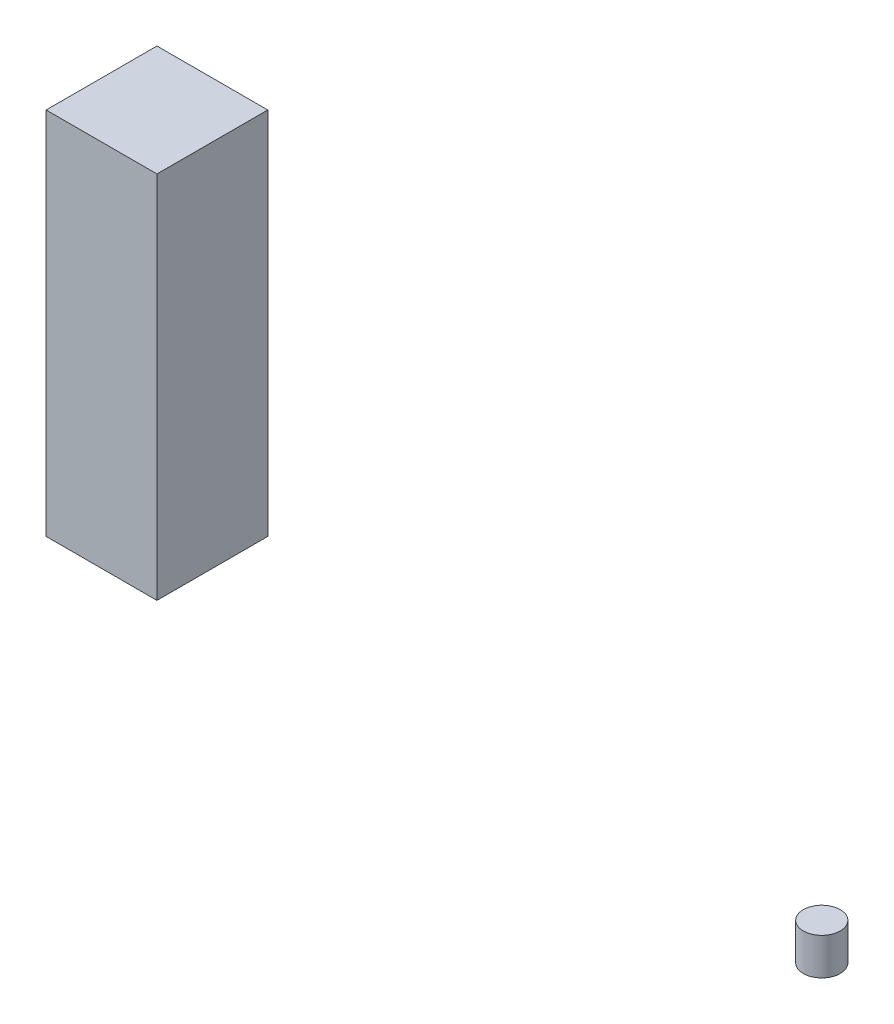
ISO-10303-21;
HEADER;
FILE_DESCRIPTION(('STEP AP214'),'2;1');
FILE_NAME('part.step','',(''),(''),'','','');
FILE_SCHEMA(('AUTOMOTIVE_DESIGN { 1 0 10303 214 1 1 1 1 }'));
ENDSEC;
DATA;
#1=APPLICATION_CONTEXT('core data for automotive mechanical design processes');
#2=APPLICATION_PROTOCOL_DEFINITION('international standard','automotive_design',2000,#1);
#3=PRODUCT_CONTEXT('',#1,'mechanical');
#4=PRODUCT('Part','Part','',(#3));
#5=PRODUCT_RELATED_PRODUCT_CATEGORY('part','',(#4));
#6=PRODUCT_DEFINITION_FORMATION('','',#4);
#7=PRODUCT_DEFINITION_CONTEXT('part definition',#1,'design');
#8=PRODUCT_DEFINITION('design','',#6,#7);
#9=PRODUCT_DEFINITION_SHAPE('','',#8);
#10=(LENGTH_UNIT() NAMED_UNIT(*) SI_UNIT(.MILLI.,.METRE.));
#11=(NAMED_UNIT(*) PLANE_ANGLE_UNIT() SI_UNIT($,.RADIAN.));
#12=(NAMED_UNIT(*) SI_UNIT($,.STERADIAN.) SOLID_ANGLE_UNIT());
#13=UNCERTAINTY_MEASURE_WITH_UNIT(LENGTH_MEASURE(1.E-05),#10,'distance_accuracy_value','');
#14=(GEOMETRIC_REPRESENTATION_CONTEXT(3) GLOBAL_UNCERTAINTY_ASSIGNED_CONTEXT((#13)) GLOBAL_UNIT_ASSIGNED_CONTEXT((#10,
#11,#12)) REPRESENTATION_CONTEXT('',''));
#15=CARTESIAN_POINT('',(0.,0.,0.));
#16=DIRECTION('',(0.,0.,1.));
#17=DIRECTION('',(1.,0.,0.));
#18=AXIS2_PLACEMENT_3D('',#15,#16,#17);
#19=CARTESIAN_POINT('',(180.,-10.,0.));
#20=DIRECTION('',(0.,1.,0.));
#21=DIRECTION('',(0.,0.,1.));
#22=AXIS2_PLACEMENT_3D('',#19,#20,#21);
#23=CYLINDRICAL_SURFACE('',#22,5.00000000000002);
#24=CARTESIAN_POINT('',(180.,-10.,0.));
#25=DIRECTION('',(0.,-1.,0.));
#26=DIRECTION('',(0.,0.,-1.));
#27=AXIS2_PLACEMENT_3D('',#24,#25,#26);
#28=CIRCLE('',#27,5.00000000000002);
#29=CARTESIAN_POINT('',(180.,-10.,-5.00000000000002));
#30=VERTEX_POINT('',#29);
#31=EDGE_CURVE('E11',#30,#30,#28,.T.);
#32=ORIENTED_EDGE('',*,*,#31,.F.);
#33=EDGE_LOOP('',(#32));
#34=FACE_BOUND('',#33,.T.);
#35=CARTESIAN_POINT('',(180.,0.,0.));
#36=DIRECTION('',(0.,-1.,0.));
#37=DIRECTION('',(0.,0.,-1.));
#38=AXIS2_PLACEMENT_3D('',#35,#36,#37);
#39=CIRCLE('',#38,5.00000000000002);
#40=CARTESIAN_POINT('',(180.,0.,-5.00000000000002));
#41=VERTEX_POINT('',#40);
#42=EDGE_CURVE('E44',#41,#41,#39,.T.);
#43=ORIENTED_EDGE('',*,*,#42,.T.);
#44=EDGE_LOOP('',(#43));
#45=FACE_BOUND('',#44,.T.);
#46=ADVANCED_FACE('F41',(#34,#45),#23,.T.);
#47=CARTESIAN_POINT('',(180.,-10.,0.));
#48=DIRECTION('',(0.,-1.,0.));
#49=DIRECTION('',(0.,0.,-1.));
#50=AXIS2_PLACEMENT_3D('',#47,#48,#49);
#51=PLANE('',#50);
#52=ORIENTED_EDGE('',*,*,#31,.T.);
#53=EDGE_LOOP('',(#52));
#54=FACE_BOUND('',#53,.T.);
#55=ADVANCED_FACE('F56',(#54),#51,.T.);
#56=CARTESIAN_POINT('',(180.,0.,0.));
#57=DIRECTION('',(0.,-1.,0.));
#58=DIRECTION('',(0.,0.,-1.));
#59=AXIS2_PLACEMENT_3D('',#56,#57,#58);
#60=PLANE('',#59);
#61=ORIENTED_EDGE('',*,*,#42,.F.);
#62=EDGE_LOOP('',(#61));
#63=FACE_BOUND('',#62,.T.);
#64=ADVANCED_FACE('F54',(#63),#60,.F.);
#65=CLOSED_SHELL('',(#46,#55,#64));
#66=MANIFOLD_SOLID_BREP('B2',#65);
#67=CARTESIAN_POINT('',(-15.,100.,15.));
#68=DIRECTION('',(1.,0.,0.));
#69=DIRECTION('',(0.,0.,-1.));
#70=AXIS2_PLACEMENT_3D('',#67,#68,#69);
#71=PLANE('',#70);
#72=DIRECTION('',(0.,0.,1.));
#73=VECTOR('',#72,1.);
#74=CARTESIAN_POINT('',(-15.,0.,15.));
#75=LINE('',#74,#73);
#76=CARTESIAN_POINT('',(-15.,0.,-15.));
#77=VERTEX_POINT('',#76);
#78=CARTESIAN_POINT('',(-15.,0.,15.));
#79=VERTEX_POINT('',#78);
#80=EDGE_CURVE('E145',#77,#79,#75,.T.);
#81=ORIENTED_EDGE('',*,*,#80,.T.);
#82=DIRECTION('',(0.,-1.,0.));
#83=VECTOR('',#82,1.);
#84=CARTESIAN_POINT('',(-15.,100.,15.));
#85=LINE('',#84,#83);
#86=CARTESIAN_POINT('',(-15.,100.,15.));
#87=VERTEX_POINT('',#86);
#88=EDGE_CURVE('E39',#87,#79,#85,.T.);
#89=ORIENTED_EDGE('',*,*,#88,.F.);
#90=DIRECTION('',(0.,0.,1.));
#91=VECTOR('',#90,1.);
#92=CARTESIAN_POINT('',(-15.,100.,15.));
#93=LINE('',#92,#91);
#94=CARTESIAN_POINT('',(-15.,100.,-15.));
#95=VERTEX_POINT('',#94);
#96=EDGE_CURVE('E133',#95,#87,#93,.T.);
#97=ORIENTED_EDGE('',*,*,#96,.F.);
#98=DIRECTION('',(0.,-1.,0.));
#99=VECTOR('',#98,1.);
#100=CARTESIAN_POINT('',(-15.,100.,-15.));
#101=LINE('',#100,#99);
#102=EDGE_CURVE('E141',#95,#77,#101,.T.);
#103=ORIENTED_EDGE('',*,*,#102,.T.);
#104=EDGE_LOOP('',(#81,#89,#97,#103));
#105=FACE_BOUND('',#104,.T.);
#106=ADVANCED_FACE('F82',(#105),#71,.F.);
#107=CARTESIAN_POINT('',(15.,100.,15.));
#108=DIRECTION('',(0.,0.,-1.));
#109=DIRECTION('',(-1.,0.,0.));
#110=AXIS2_PLACEMENT_3D('',#107,#108,#109);
#111=PLANE('',#110);
#112=DIRECTION('',(1.,0.,0.));
#113=VECTOR('',#112,1.);
#114=CARTESIAN_POINT('',(15.,0.,15.));
#115=LINE('',#114,#113);
#116=CARTESIAN_POINT('',(15.,0.,15.));
#117=VERTEX_POINT('',#116);
#118=EDGE_CURVE('E137',#79,#117,#115,.T.);
#119=ORIENTED_EDGE('',*,*,#118,.T.);
#120=DIRECTION('',(0.,-1.,0.));
#121=VECTOR('',#120,1.);
#122=CARTESIAN_POINT('',(15.,100.,15.));
#123=LINE('',#122,#121);
#124=CARTESIAN_POINT('',(15.,100.,15.));
#125=VERTEX_POINT('',#124);
#126=EDGE_CURVE('E90',#125,#117,#123,.T.);
#127=ORIENTED_EDGE('',*,*,#126,.F.);
#128=DIRECTION('',(1.,0.,0.));
#129=VECTOR('',#128,1.);
#130=CARTESIAN_POINT('',(15.,100.,15.));
#131=LINE('',#130,#129);
#132=EDGE_CURVE('E128',#87,#125,#131,.T.);
#133=ORIENTED_EDGE('',*,*,#132,.F.);
#134=ORIENTED_EDGE('',*,*,#88,.T.);
#135=EDGE_LOOP('',(#119,#127,#133,#134));
#136=FACE_BOUND('',#135,.T.);
#137=ADVANCED_FACE('F136',(#136),#111,.F.);
#138=CARTESIAN_POINT('',(15.,100.,15.));
#139=DIRECTION('',(-1.,0.,0.));
#140=DIRECTION('',(0.,0.,1.));
#141=AXIS2_PLACEMENT_3D('',#138,#139,#140);
#142=PLANE('',#141);
#143=DIRECTION('',(0.,0.,-1.));
#144=VECTOR('',#143,1.);
#145=CARTESIAN_POINT('',(15.,0.,15.));
#146=LINE('',#145,#144);
#147=CARTESIAN_POINT('',(15.,0.,-15.));
#148=VERTEX_POINT('',#147);
#149=EDGE_CURVE('E115',#117,#148,#146,.T.);
#150=ORIENTED_EDGE('',*,*,#149,.T.);
#151=DIRECTION('',(0.,-1.,0.));
#152=VECTOR('',#151,1.);
#153=CARTESIAN_POINT('',(15.,100.,-15.));
#154=LINE('',#153,#152);
#155=CARTESIAN_POINT('',(15.,100.,-15.));
#156=VERTEX_POINT('',#155);
#157=EDGE_CURVE('E138',#156,#148,#154,.T.);
#158=ORIENTED_EDGE('',*,*,#157,.F.);
#159=DIRECTION('',(0.,0.,-1.));
#160=VECTOR('',#159,1.);
#161=CARTESIAN_POINT('',(15.,100.,15.));
#162=LINE('',#161,#160);
#163=EDGE_CURVE('E131',#125,#156,#162,.T.);
#164=ORIENTED_EDGE('',*,*,#163,.F.);
#165=ORIENTED_EDGE('',*,*,#126,.T.);
#166=EDGE_LOOP('',(#150,#158,#164,#165));
#167=FACE_BOUND('',#166,.T.);
#168=ADVANCED_FACE('F139',(#167),#142,.F.);
#169=CARTESIAN_POINT('',(15.,100.,-15.));
#170=DIRECTION('',(0.,0.,1.));
#171=DIRECTION('',(1.,0.,0.));
#172=AXIS2_PLACEMENT_3D('',#169,#170,#171);
#173=PLANE('',#172);
#174=DIRECTION('',(-1.,0.,0.));
#175=VECTOR('',#174,1.);
#176=CARTESIAN_POINT('',(15.,0.,-15.));
#177=LINE('',#176,#175);
#178=EDGE_CURVE('E121',#148,#77,#177,.T.);
#179=ORIENTED_EDGE('',*,*,#178,.T.);
#180=ORIENTED_EDGE('',*,*,#102,.F.);
#181=DIRECTION('',(-1.,0.,0.));
#182=VECTOR('',#181,1.);
#183=CARTESIAN_POINT('',(15.,100.,-15.));
#184=LINE('',#183,#182);
#185=EDGE_CURVE('E98',#156,#95,#184,.T.);
#186=ORIENTED_EDGE('',*,*,#185,.F.);
#187=ORIENTED_EDGE('',*,*,#157,.T.);
#188=EDGE_LOOP('',(#179,#180,#186,#187));
#189=FACE_BOUND('',#188,.T.);
#190=ADVANCED_FACE('F152',(#189),#173,.F.);
#191=CARTESIAN_POINT('',(0.,100.,0.));
#192=DIRECTION('',(0.,1.,0.));
#193=DIRECTION('',(0.,0.,1.));
#194=AXIS2_PLACEMENT_3D('',#191,#192,#193);
#195=PLANE('',#194);
#196=ORIENTED_EDGE('',*,*,#96,.T.);
#197=ORIENTED_EDGE('',*,*,#132,.T.);
#198=ORIENTED_EDGE('',*,*,#163,.T.);
#199=ORIENTED_EDGE('',*,*,#185,.T.);
#200=EDGE_LOOP('',(#196,#197,#198,#199));
#201=FACE_BOUND('',#200,.T.);
#202=ADVANCED_FACE('F129',(#201),#195,.T.);
#203=CARTESIAN_POINT('',(0.,0.,0.));
#204=DIRECTION('',(0.,1.,0.));
#205=DIRECTION('',(0.,0.,1.));
#206=AXIS2_PLACEMENT_3D('',#203,#204,#205);
#207=PLANE('',#206);
#208=ORIENTED_EDGE('',*,*,#80,.F.);
#209=ORIENTED_EDGE('',*,*,#178,.F.);
#210=ORIENTED_EDGE('',*,*,#149,.F.);
#211=ORIENTED_EDGE('',*,*,#118,.F.);
#212=EDGE_LOOP('',(#208,#209,#210,#211));
#213=FACE_BOUND('',#212,.T.);
#214=ADVANCED_FACE('F155',(#213),#207,.F.);
#215=CLOSED_SHELL('',(#106,#137,#168,#190,#202,#214));
#216=MANIFOLD_SOLID_BREP('B6',#215);
#217=ADVANCED_BREP_SHAPE_REPRESENTATION('',(#18,#66,#216),#14);
#218=SHAPE_DEFINITION_REPRESENTATION(#9,#217);
ENDSEC;
END-ISO-10303-21;
